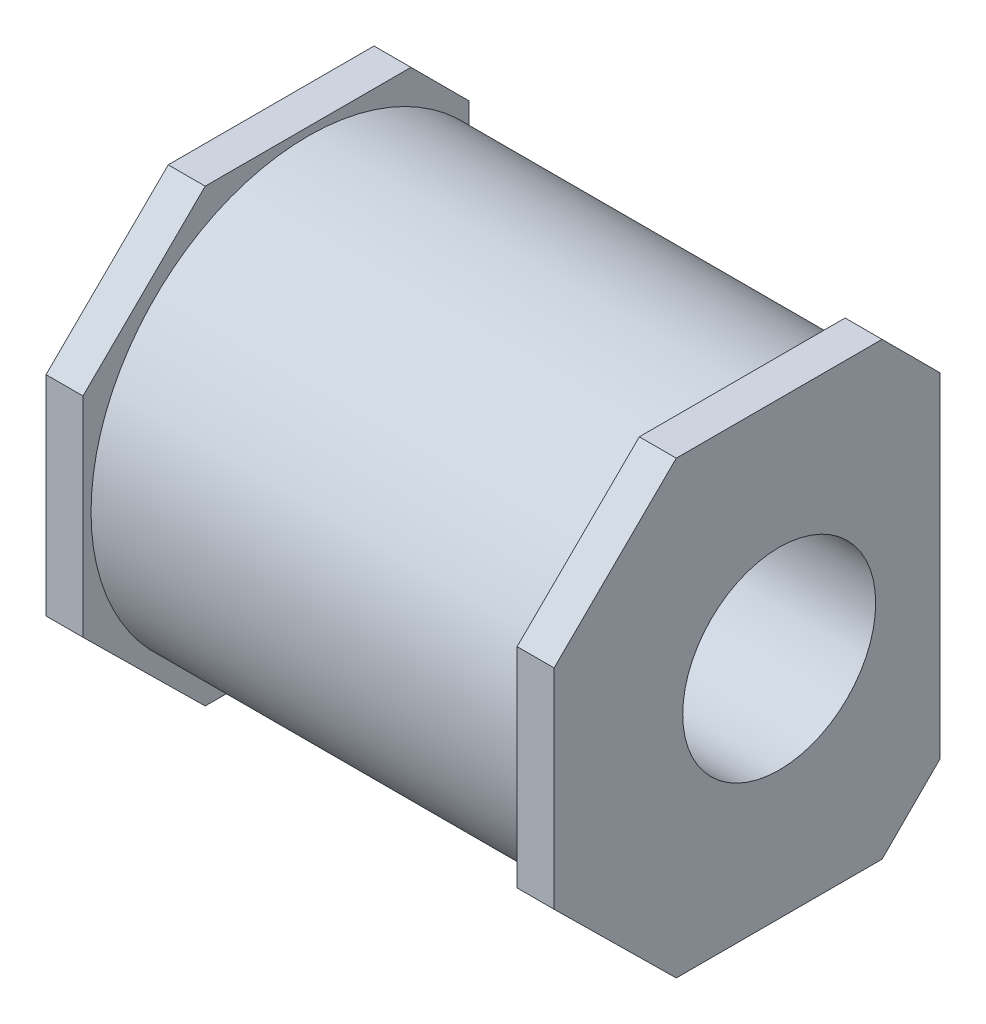
ISO-10303-21;
HEADER;
FILE_DESCRIPTION(('STEP AP214'),'2;1');
FILE_NAME('part.step','',(''),(''),'','','');
FILE_SCHEMA(('AUTOMOTIVE_DESIGN { 1 0 10303 214 1 1 1 1 }'));
ENDSEC;
DATA;
#1=APPLICATION_CONTEXT('core data for automotive mechanical design processes');
#2=APPLICATION_PROTOCOL_DEFINITION('international standard','automotive_design',2000,#1);
#3=PRODUCT_CONTEXT('',#1,'mechanical');
#4=PRODUCT('Part','Part','',(#3));
#5=PRODUCT_RELATED_PRODUCT_CATEGORY('part','',(#4));
#6=PRODUCT_DEFINITION_FORMATION('','',#4);
#7=PRODUCT_DEFINITION_CONTEXT('part definition',#1,'design');
#8=PRODUCT_DEFINITION('design','',#6,#7);
#9=PRODUCT_DEFINITION_SHAPE('','',#8);
#10=(LENGTH_UNIT() NAMED_UNIT(*) SI_UNIT(.MILLI.,.METRE.));
#11=(NAMED_UNIT(*) PLANE_ANGLE_UNIT() SI_UNIT($,.RADIAN.));
#12=(NAMED_UNIT(*) SI_UNIT($,.STERADIAN.) SOLID_ANGLE_UNIT());
#13=UNCERTAINTY_MEASURE_WITH_UNIT(LENGTH_MEASURE(1.E-05),#10,'distance_accuracy_value','');
#14=(GEOMETRIC_REPRESENTATION_CONTEXT(3) GLOBAL_UNCERTAINTY_ASSIGNED_CONTEXT((#13)) GLOBAL_UNIT_ASSIGNED_CONTEXT((#10,
#11,#12)) REPRESENTATION_CONTEXT('',''));
#15=CARTESIAN_POINT('',(0.,0.,0.));
#16=DIRECTION('',(0.,0.,1.));
#17=DIRECTION('',(1.,0.,0.));
#18=AXIS2_PLACEMENT_3D('',#15,#16,#17);
#19=CARTESIAN_POINT('',(-15.,2.4,19.1));
#20=DIRECTION('',(-1.,0.,0.));
#21=DIRECTION('',(0.,0.,1.));
#22=AXIS2_PLACEMENT_3D('',#19,#20,#21);
#23=CYLINDRICAL_SURFACE('',#22,6.);
#24=CARTESIAN_POINT('',(16.6,2.39999999999999,19.1));
#25=DIRECTION('',(-1.,0.,0.));
#26=DIRECTION('',(0.,0.,1.));
#27=AXIS2_PLACEMENT_3D('',#24,#25,#26);
#28=CIRCLE('',#27,6.);
#29=CARTESIAN_POINT('',(16.6,2.39999999999999,25.1));
#30=VERTEX_POINT('',#29);
#31=EDGE_CURVE('E239',#30,#30,#28,.F.);
#32=ORIENTED_EDGE('',*,*,#31,.T.);
#33=EDGE_LOOP('',(#32));
#34=FACE_BOUND('',#33,.T.);
#35=CARTESIAN_POINT('',(-15.,2.4,19.1));
#36=DIRECTION('',(-1.,0.,0.));
#37=DIRECTION('',(0.,0.,1.));
#38=AXIS2_PLACEMENT_3D('',#35,#36,#37);
#39=CIRCLE('',#38,6.);
#40=CARTESIAN_POINT('',(-15.,2.4,25.1));
#41=VERTEX_POINT('',#40);
#42=EDGE_CURVE('E20',#41,#41,#39,.F.);
#43=ORIENTED_EDGE('',*,*,#42,.F.);
#44=EDGE_LOOP('',(#43));
#45=FACE_BOUND('',#44,.T.);
#46=ADVANCED_FACE('F17',(#34,#45),#23,.F.);
#47=CARTESIAN_POINT('',(-15.,16.4,25.5));
#48=DIRECTION('',(0.,1.,0.));
#49=DIRECTION('',(0.,0.,1.));
#50=AXIS2_PLACEMENT_3D('',#47,#48,#49);
#51=PLANE('',#50);
#52=DIRECTION('',(0.,0.,1.));
#53=VECTOR('',#52,1.);
#54=CARTESIAN_POINT('',(16.6,16.4,20.291223236998));
#55=LINE('',#54,#53);
#56=CARTESIAN_POINT('',(16.6,16.3999999999993,25.4999999999993));
#57=VERTEX_POINT('',#56);
#58=CARTESIAN_POINT('',(16.6,16.4,12.7));
#59=VERTEX_POINT('',#58);
#60=EDGE_CURVE('E201',#57,#59,#55,.F.);
#61=ORIENTED_EDGE('',*,*,#60,.T.);
#62=DIRECTION('',(1.,0.,0.));
#63=VECTOR('',#62,1.);
#64=CARTESIAN_POINT('',(-15.,16.4,12.7));
#65=LINE('',#64,#63);
#66=CARTESIAN_POINT('',(14.3,16.4,12.7));
#67=VERTEX_POINT('',#66);
#68=EDGE_CURVE('E151',#67,#59,#65,.T.);
#69=ORIENTED_EDGE('',*,*,#68,.F.);
#70=DIRECTION('',(0.,0.,1.));
#71=VECTOR('',#70,1.);
#72=CARTESIAN_POINT('',(14.3,16.4,19.1));
#73=LINE('',#72,#71);
#74=CARTESIAN_POINT('',(14.3,16.3999999999993,25.4999999999993));
#75=VERTEX_POINT('',#74);
#76=EDGE_CURVE('E145',#67,#75,#73,.T.);
#77=ORIENTED_EDGE('',*,*,#76,.T.);
#78=DIRECTION('',(1.,0.,0.));
#79=VECTOR('',#78,1.);
#80=CARTESIAN_POINT('',(-15.,16.3999999999978,25.4999999999978));
#81=LINE('',#80,#79);
#82=EDGE_CURVE('E148',#57,#75,#81,.F.);
#83=ORIENTED_EDGE('',*,*,#82,.F.);
#84=EDGE_LOOP('',(#61,#69,#77,#83));
#85=FACE_BOUND('',#84,.T.);
#86=ADVANCED_FACE('F147',(#85),#51,.T.);
#87=CARTESIAN_POINT('',(-15.,8.9,33.1));
#88=DIRECTION('',(0.,0.711773999329005,0.702408551969005));
#89=DIRECTION('',(0.,-0.702408551969005,0.711773999329005));
#90=AXIS2_PLACEMENT_3D('',#87,#88,#89);
#91=PLANE('',#90);
#92=DIRECTION('',(0.,0.702408551969211,-0.711773999328801));
#93=VECTOR('',#92,1.);
#94=CARTESIAN_POINT('',(16.6,8.9,33.1));
#95=LINE('',#94,#93);
#96=CARTESIAN_POINT('',(16.6,8.9,33.1));
#97=VERTEX_POINT('',#96);
#98=EDGE_CURVE('E162',#97,#57,#95,.T.);
#99=ORIENTED_EDGE('',*,*,#98,.T.);
#100=ORIENTED_EDGE('',*,*,#82,.T.);
#101=DIRECTION('',(0.,-0.702408551969211,0.711773999328801));
#102=VECTOR('',#101,1.);
#103=CARTESIAN_POINT('',(14.3,16.4,25.5));
#104=LINE('',#103,#102);
#105=CARTESIAN_POINT('',(14.3,8.9,33.1));
#106=VERTEX_POINT('',#105);
#107=EDGE_CURVE('E155',#75,#106,#104,.T.);
#108=ORIENTED_EDGE('',*,*,#107,.T.);
#109=DIRECTION('',(1.,0.,0.));
#110=VECTOR('',#109,1.);
#111=CARTESIAN_POINT('',(-15.,8.9,33.1));
#112=LINE('',#111,#110);
#113=EDGE_CURVE('E164',#97,#106,#112,.F.);
#114=ORIENTED_EDGE('',*,*,#113,.F.);
#115=EDGE_LOOP('',(#99,#100,#108,#114));
#116=FACE_BOUND('',#115,.T.);
#117=ADVANCED_FACE('F159',(#116),#91,.T.);
#118=CARTESIAN_POINT('',(-15.,-4.1,33.1));
#119=DIRECTION('',(0.,0.,1.));
#120=DIRECTION('',(1.,0.,0.));
#121=AXIS2_PLACEMENT_3D('',#118,#119,#120);
#122=PLANE('',#121);
#123=DIRECTION('',(0.,-1.,0.));
#124=VECTOR('',#123,1.);
#125=CARTESIAN_POINT('',(16.6,2.4,33.1));
#126=LINE('',#125,#124);
#127=CARTESIAN_POINT('',(16.6,-4.10000000000074,33.1000000000007));
#128=VERTEX_POINT('',#127);
#129=EDGE_CURVE('E207',#128,#97,#126,.F.);
#130=ORIENTED_EDGE('',*,*,#129,.T.);
#131=ORIENTED_EDGE('',*,*,#113,.T.);
#132=DIRECTION('',(0.,1.,0.));
#133=VECTOR('',#132,1.);
#134=CARTESIAN_POINT('',(14.3,2.4,33.1));
#135=LINE('',#134,#133);
#136=CARTESIAN_POINT('',(14.3,-4.10000000000074,33.1000000000007));
#137=VERTEX_POINT('',#136);
#138=EDGE_CURVE('E170',#106,#137,#135,.F.);
#139=ORIENTED_EDGE('',*,*,#138,.T.);
#140=DIRECTION('',(1.,0.,0.));
#141=VECTOR('',#140,1.);
#142=CARTESIAN_POINT('',(-15.,-4.10000000000221,33.1000000000022));
#143=LINE('',#142,#141);
#144=EDGE_CURVE('E364',#128,#137,#143,.F.);
#145=ORIENTED_EDGE('',*,*,#144,.F.);
#146=EDGE_LOOP('',(#130,#131,#139,#145));
#147=FACE_BOUND('',#146,.T.);
#148=ADVANCED_FACE('F376',(#147),#122,.T.);
#149=CARTESIAN_POINT('',(-15.,-11.6,25.5));
#150=DIRECTION('',(0.,-0.711773999329005,0.702408551969005));
#151=DIRECTION('',(0.,-0.702408551969005,-0.711773999329005));
#152=AXIS2_PLACEMENT_3D('',#149,#150,#151);
#153=PLANE('',#152);
#154=DIRECTION('',(0.,0.702408551969211,0.711773999328801));
#155=VECTOR('',#154,1.);
#156=CARTESIAN_POINT('',(16.6,-11.6,25.5));
#157=LINE('',#156,#155);
#158=CARTESIAN_POINT('',(16.6,-11.6,25.5));
#159=VERTEX_POINT('',#158);
#160=EDGE_CURVE('E198',#159,#128,#157,.T.);
#161=ORIENTED_EDGE('',*,*,#160,.T.);
#162=ORIENTED_EDGE('',*,*,#144,.T.);
#163=DIRECTION('',(0.,-0.702408551969211,-0.711773999328801));
#164=VECTOR('',#163,1.);
#165=CARTESIAN_POINT('',(14.3,-4.1,33.1));
#166=LINE('',#165,#164);
#167=CARTESIAN_POINT('',(14.3,-11.6,25.5));
#168=VERTEX_POINT('',#167);
#169=EDGE_CURVE('E172',#137,#168,#166,.T.);
#170=ORIENTED_EDGE('',*,*,#169,.T.);
#171=DIRECTION('',(1.,0.,0.));
#172=VECTOR('',#171,1.);
#173=CARTESIAN_POINT('',(-15.,-11.6,25.5));
#174=LINE('',#173,#172);
#175=EDGE_CURVE('E344',#159,#168,#174,.F.);
#176=ORIENTED_EDGE('',*,*,#175,.F.);
#177=EDGE_LOOP('',(#161,#162,#170,#176));
#178=FACE_BOUND('',#177,.T.);
#179=ADVANCED_FACE('F422',(#178),#153,.T.);
#180=CARTESIAN_POINT('',(-15.,-11.6,12.7));
#181=DIRECTION('',(0.,-1.,0.));
#182=DIRECTION('',(0.,0.,-1.));
#183=AXIS2_PLACEMENT_3D('',#180,#181,#182);
#184=PLANE('',#183);
#185=DIRECTION('',(0.,0.,1.));
#186=VECTOR('',#185,1.);
#187=CARTESIAN_POINT('',(16.6,-11.6,20.291223236998));
#188=LINE('',#187,#186);
#189=CARTESIAN_POINT('',(16.6,-11.6,12.7));
#190=VERTEX_POINT('',#189);
#191=EDGE_CURVE('E185',#190,#159,#188,.T.);
#192=ORIENTED_EDGE('',*,*,#191,.T.);
#193=ORIENTED_EDGE('',*,*,#175,.T.);
#194=DIRECTION('',(0.,0.,1.));
#195=VECTOR('',#194,1.);
#196=CARTESIAN_POINT('',(14.3,-11.6,19.1));
#197=LINE('',#196,#195);
#198=CARTESIAN_POINT('',(14.3,-11.6,12.7));
#199=VERTEX_POINT('',#198);
#200=EDGE_CURVE('E358',#168,#199,#197,.F.);
#201=ORIENTED_EDGE('',*,*,#200,.T.);
#202=DIRECTION('',(1.,0.,0.));
#203=VECTOR('',#202,1.);
#204=CARTESIAN_POINT('',(-15.,-11.6,12.7));
#205=LINE('',#204,#203);
#206=EDGE_CURVE('E245',#190,#199,#205,.F.);
#207=ORIENTED_EDGE('',*,*,#206,.F.);
#208=EDGE_LOOP('',(#192,#193,#201,#207));
#209=FACE_BOUND('',#208,.T.);
#210=ADVANCED_FACE('F420',(#209),#184,.T.);
#211=CARTESIAN_POINT('',(-15.,16.4,25.5));
#212=DIRECTION('',(0.,1.,0.));
#213=DIRECTION('',(0.,0.,1.));
#214=AXIS2_PLACEMENT_3D('',#211,#212,#213);
#215=PLANE('',#214);
#216=DIRECTION('',(0.,0.,1.));
#217=VECTOR('',#216,1.);
#218=CARTESIAN_POINT('',(-12.7,16.4,19.1));
#219=LINE('',#218,#217);
#220=CARTESIAN_POINT('',(-12.7,16.4,12.7));
#221=VERTEX_POINT('',#220);
#222=CARTESIAN_POINT('',(-12.7,16.3999999999993,25.4999999999993));
#223=VERTEX_POINT('',#222);
#224=EDGE_CURVE('E283',#221,#223,#219,.T.);
#225=ORIENTED_EDGE('',*,*,#224,.F.);
#226=DIRECTION('',(1.,0.,0.));
#227=VECTOR('',#226,1.);
#228=CARTESIAN_POINT('',(-15.,16.4,12.7));
#229=LINE('',#228,#227);
#230=CARTESIAN_POINT('',(-15.,16.4,12.7));
#231=VERTEX_POINT('',#230);
#232=EDGE_CURVE('E186',#231,#221,#229,.T.);
#233=ORIENTED_EDGE('',*,*,#232,.F.);
#234=DIRECTION('',(0.,0.,1.));
#235=VECTOR('',#234,1.);
#236=CARTESIAN_POINT('',(-15.,16.4,20.291223236998));
#237=LINE('',#236,#235);
#238=CARTESIAN_POINT('',(-15.,16.3999999999993,25.4999999999993));
#239=VERTEX_POINT('',#238);
#240=EDGE_CURVE('E218',#239,#231,#237,.F.);
#241=ORIENTED_EDGE('',*,*,#240,.F.);
#242=DIRECTION('',(1.,0.,0.));
#243=VECTOR('',#242,1.);
#244=CARTESIAN_POINT('',(-15.,16.3999999999978,25.4999999999978));
#245=LINE('',#244,#243);
#246=EDGE_CURVE('E336',#223,#239,#245,.F.);
#247=ORIENTED_EDGE('',*,*,#246,.F.);
#248=EDGE_LOOP('',(#225,#233,#241,#247));
#249=FACE_BOUND('',#248,.T.);
#250=ADVANCED_FACE('F430',(#249),#215,.T.);
#251=CARTESIAN_POINT('',(-15.,8.9,33.1));
#252=DIRECTION('',(0.,0.711773999329005,0.702408551969005));
#253=DIRECTION('',(0.,-0.702408551969005,0.711773999329005));
#254=AXIS2_PLACEMENT_3D('',#251,#252,#253);
#255=PLANE('',#254);
#256=DIRECTION('',(0.,-0.702408551969211,0.711773999328801));
#257=VECTOR('',#256,1.);
#258=CARTESIAN_POINT('',(-12.7,16.4,25.5));
#259=LINE('',#258,#257);
#260=CARTESIAN_POINT('',(-12.7,8.9,33.1));
#261=VERTEX_POINT('',#260);
#262=EDGE_CURVE('E332',#223,#261,#259,.T.);
#263=ORIENTED_EDGE('',*,*,#262,.F.);
#264=ORIENTED_EDGE('',*,*,#246,.T.);
#265=DIRECTION('',(0.,0.702408551969211,-0.711773999328801));
#266=VECTOR('',#265,1.);
#267=CARTESIAN_POINT('',(-15.,8.9,33.1));
#268=LINE('',#267,#266);
#269=CARTESIAN_POINT('',(-15.,8.9,33.1));
#270=VERTEX_POINT('',#269);
#271=EDGE_CURVE('E220',#270,#239,#268,.T.);
#272=ORIENTED_EDGE('',*,*,#271,.F.);
#273=DIRECTION('',(1.,0.,0.));
#274=VECTOR('',#273,1.);
#275=CARTESIAN_POINT('',(-15.,8.9,33.1));
#276=LINE('',#275,#274);
#277=EDGE_CURVE('E327',#261,#270,#276,.F.);
#278=ORIENTED_EDGE('',*,*,#277,.F.);
#279=EDGE_LOOP('',(#263,#264,#272,#278));
#280=FACE_BOUND('',#279,.T.);
#281=ADVANCED_FACE('F474',(#280),#255,.T.);
#282=CARTESIAN_POINT('',(-15.,-4.1,33.1));
#283=DIRECTION('',(0.,0.,1.));
#284=DIRECTION('',(1.,0.,0.));
#285=AXIS2_PLACEMENT_3D('',#282,#283,#284);
#286=PLANE('',#285);
#287=DIRECTION('',(0.,1.,0.));
#288=VECTOR('',#287,1.);
#289=CARTESIAN_POINT('',(-12.7,2.4,33.1));
#290=LINE('',#289,#288);
#291=CARTESIAN_POINT('',(-12.7,-4.10000000000074,33.1000000000007));
#292=VERTEX_POINT('',#291);
#293=EDGE_CURVE('E323',#261,#292,#290,.F.);
#294=ORIENTED_EDGE('',*,*,#293,.F.);
#295=ORIENTED_EDGE('',*,*,#277,.T.);
#296=DIRECTION('',(0.,-1.,0.));
#297=VECTOR('',#296,1.);
#298=CARTESIAN_POINT('',(-15.,2.4,33.1));
#299=LINE('',#298,#297);
#300=CARTESIAN_POINT('',(-15.,-4.10000000000073,33.1000000000007));
#301=VERTEX_POINT('',#300);
#302=EDGE_CURVE('E225',#301,#270,#299,.F.);
#303=ORIENTED_EDGE('',*,*,#302,.F.);
#304=DIRECTION('',(1.,0.,0.));
#305=VECTOR('',#304,1.);
#306=CARTESIAN_POINT('',(-15.,-4.1000000000022,33.1000000000022));
#307=LINE('',#306,#305);
#308=EDGE_CURVE('E318',#292,#301,#307,.F.);
#309=ORIENTED_EDGE('',*,*,#308,.F.);
#310=EDGE_LOOP('',(#294,#295,#303,#309));
#311=FACE_BOUND('',#310,.T.);
#312=ADVANCED_FACE('F470',(#311),#286,.T.);
#313=CARTESIAN_POINT('',(-15.,-11.6,25.5));
#314=DIRECTION('',(0.,-0.711773999329005,0.702408551969005));
#315=DIRECTION('',(0.,-0.702408551969005,-0.711773999329005));
#316=AXIS2_PLACEMENT_3D('',#313,#314,#315);
#317=PLANE('',#316);
#318=DIRECTION('',(0.,-0.702408551969211,-0.711773999328801));
#319=VECTOR('',#318,1.);
#320=CARTESIAN_POINT('',(-12.7,-4.1,33.1));
#321=LINE('',#320,#319);
#322=CARTESIAN_POINT('',(-12.7,-11.6,25.5));
#323=VERTEX_POINT('',#322);
#324=EDGE_CURVE('E314',#292,#323,#321,.T.);
#325=ORIENTED_EDGE('',*,*,#324,.F.);
#326=ORIENTED_EDGE('',*,*,#308,.T.);
#327=DIRECTION('',(0.,0.702408551969211,0.711773999328801));
#328=VECTOR('',#327,1.);
#329=CARTESIAN_POINT('',(-15.,-11.6,25.5));
#330=LINE('',#329,#328);
#331=CARTESIAN_POINT('',(-15.,-11.6,25.5));
#332=VERTEX_POINT('',#331);
#333=EDGE_CURVE('E192',#332,#301,#330,.T.);
#334=ORIENTED_EDGE('',*,*,#333,.F.);
#335=DIRECTION('',(1.,0.,0.));
#336=VECTOR('',#335,1.);
#337=CARTESIAN_POINT('',(-15.,-11.6,25.5));
#338=LINE('',#337,#336);
#339=EDGE_CURVE('E193',#323,#332,#338,.F.);
#340=ORIENTED_EDGE('',*,*,#339,.F.);
#341=EDGE_LOOP('',(#325,#326,#334,#340));
#342=FACE_BOUND('',#341,.T.);
#343=ADVANCED_FACE('F466',(#342),#317,.T.);
#344=CARTESIAN_POINT('',(-15.,-11.6,12.7));
#345=DIRECTION('',(0.,-1.,0.));
#346=DIRECTION('',(0.,0.,-1.));
#347=AXIS2_PLACEMENT_3D('',#344,#345,#346);
#348=PLANE('',#347);
#349=DIRECTION('',(0.,0.,1.));
#350=VECTOR('',#349,1.);
#351=CARTESIAN_POINT('',(-12.7,-11.6,19.1));
#352=LINE('',#351,#350);
#353=CARTESIAN_POINT('',(-12.7,-11.6,12.7));
#354=VERTEX_POINT('',#353);
#355=EDGE_CURVE('E311',#323,#354,#352,.F.);
#356=ORIENTED_EDGE('',*,*,#355,.F.);
#357=ORIENTED_EDGE('',*,*,#339,.T.);
#358=DIRECTION('',(0.,0.,1.));
#359=VECTOR('',#358,1.);
#360=CARTESIAN_POINT('',(-15.,-11.6,20.291223236998));
#361=LINE('',#360,#359);
#362=CARTESIAN_POINT('',(-15.,-11.6,12.7));
#363=VERTEX_POINT('',#362);
#364=EDGE_CURVE('E189',#363,#332,#361,.T.);
#365=ORIENTED_EDGE('',*,*,#364,.F.);
#366=DIRECTION('',(1.,0.,0.));
#367=VECTOR('',#366,1.);
#368=CARTESIAN_POINT('',(-15.,-11.6,12.7));
#369=LINE('',#368,#367);
#370=EDGE_CURVE('E274',#354,#363,#369,.F.);
#371=ORIENTED_EDGE('',*,*,#370,.F.);
#372=EDGE_LOOP('',(#356,#357,#365,#371));
#373=FACE_BOUND('',#372,.T.);
#374=ADVANCED_FACE('F462',(#373),#348,.T.);
#375=CARTESIAN_POINT('',(-15.,2.4,20.291223236998));
#376=DIRECTION('',(-1.,0.,0.));
#377=DIRECTION('',(0.,-1.,0.));
#378=AXIS2_PLACEMENT_3D('',#375,#376,#377);
#379=PLANE('',#378);
#380=ORIENTED_EDGE('',*,*,#42,.T.);
#381=EDGE_LOOP('',(#380));
#382=FACE_BOUND('',#381,.T.);
#383=DIRECTION('',(0.,0.707106781186548,0.707106781186548));
#384=VECTOR('',#383,1.);
#385=CARTESIAN_POINT('',(-15.,16.4,12.7));
#386=LINE('',#385,#384);
#387=CARTESIAN_POINT('',(-15.,12.8,9.1));
#388=VERTEX_POINT('',#387);
#389=EDGE_CURVE('E292',#388,#231,#386,.T.);
#390=ORIENTED_EDGE('',*,*,#389,.F.);
#391=DIRECTION('',(0.,1.,0.));
#392=VECTOR('',#391,1.);
#393=CARTESIAN_POINT('',(-15.,12.8,9.1));
#394=LINE('',#393,#392);
#395=CARTESIAN_POINT('',(-15.,-8.,9.1));
#396=VERTEX_POINT('',#395);
#397=EDGE_CURVE('E289',#396,#388,#394,.T.);
#398=ORIENTED_EDGE('',*,*,#397,.F.);
#399=DIRECTION('',(0.,0.707106781186548,-0.707106781186548));
#400=VECTOR('',#399,1.);
#401=CARTESIAN_POINT('',(-15.,-8.,9.1));
#402=LINE('',#401,#400);
#403=EDGE_CURVE('E302',#363,#396,#402,.T.);
#404=ORIENTED_EDGE('',*,*,#403,.F.);
#405=ORIENTED_EDGE('',*,*,#364,.T.);
#406=ORIENTED_EDGE('',*,*,#333,.T.);
#407=ORIENTED_EDGE('',*,*,#302,.T.);
#408=ORIENTED_EDGE('',*,*,#271,.T.);
#409=ORIENTED_EDGE('',*,*,#240,.T.);
#410=EDGE_LOOP('',(#390,#398,#404,#405,#406,#407,#408,#409));
#411=FACE_BOUND('',#410,.T.);
#412=ADVANCED_FACE('F459',(#382,#411),#379,.T.);
#413=CARTESIAN_POINT('',(-15.,16.4,12.7));
#414=DIRECTION('',(0.,0.707106781186548,-0.707106781186548));
#415=DIRECTION('',(0.,0.707106781186548,0.707106781186548));
#416=AXIS2_PLACEMENT_3D('',#413,#414,#415);
#417=PLANE('',#416);
#418=DIRECTION('',(0.,0.707106781186547,0.707106781186548));
#419=VECTOR('',#418,1.);
#420=CARTESIAN_POINT('',(-12.7,12.8,9.1));
#421=LINE('',#420,#419);
#422=CARTESIAN_POINT('',(-12.7,12.8,9.1));
#423=VERTEX_POINT('',#422);
#424=EDGE_CURVE('E57',#423,#221,#421,.T.);
#425=ORIENTED_EDGE('',*,*,#424,.F.);
#426=DIRECTION('',(-1.,0.,0.));
#427=VECTOR('',#426,1.);
#428=CARTESIAN_POINT('',(-15.,12.8,9.1));
#429=LINE('',#428,#427);
#430=EDGE_CURVE('E279',#388,#423,#429,.F.);
#431=ORIENTED_EDGE('',*,*,#430,.F.);
#432=ORIENTED_EDGE('',*,*,#389,.T.);
#433=ORIENTED_EDGE('',*,*,#232,.T.);
#434=EDGE_LOOP('',(#425,#431,#432,#433));
#435=FACE_BOUND('',#434,.T.);
#436=ADVANCED_FACE('F456',(#435),#417,.T.);
#437=CARTESIAN_POINT('',(-15.,16.4,12.7));
#438=DIRECTION('',(0.,0.707106781186548,-0.707106781186548));
#439=DIRECTION('',(0.,0.707106781186548,0.707106781186548));
#440=AXIS2_PLACEMENT_3D('',#437,#438,#439);
#441=PLANE('',#440);
#442=DIRECTION('',(0.,-0.707106781186547,-0.707106781186548));
#443=VECTOR('',#442,1.);
#444=CARTESIAN_POINT('',(16.6,16.4,12.7));
#445=LINE('',#444,#443);
#446=CARTESIAN_POINT('',(16.6,12.8,9.10000000000002));
#447=VERTEX_POINT('',#446);
#448=EDGE_CURVE('E203',#59,#447,#445,.T.);
#449=ORIENTED_EDGE('',*,*,#448,.T.);
#450=DIRECTION('',(-1.,0.,0.));
#451=VECTOR('',#450,1.);
#452=CARTESIAN_POINT('',(-15.,12.8,9.1));
#453=LINE('',#452,#451);
#454=CARTESIAN_POINT('',(14.3,12.8,9.10000000000001));
#455=VERTEX_POINT('',#454);
#456=EDGE_CURVE('E258',#455,#447,#453,.F.);
#457=ORIENTED_EDGE('',*,*,#456,.F.);
#458=DIRECTION('',(0.,0.707106781186547,0.707106781186548));
#459=VECTOR('',#458,1.);
#460=CARTESIAN_POINT('',(14.3,12.8,9.1));
#461=LINE('',#460,#459);
#462=EDGE_CURVE('E156',#455,#67,#461,.T.);
#463=ORIENTED_EDGE('',*,*,#462,.T.);
#464=ORIENTED_EDGE('',*,*,#68,.T.);
#465=EDGE_LOOP('',(#449,#457,#463,#464));
#466=FACE_BOUND('',#465,.T.);
#467=ADVANCED_FACE('F381',(#466),#441,.T.);
#468=CARTESIAN_POINT('',(16.6,2.4,20.291223236998));
#469=DIRECTION('',(-1.,0.,0.));
#470=DIRECTION('',(0.,-1.,0.));
#471=AXIS2_PLACEMENT_3D('',#468,#469,#470);
#472=PLANE('',#471);
#473=ORIENTED_EDGE('',*,*,#31,.F.);
#474=EDGE_LOOP('',(#473));
#475=FACE_BOUND('',#474,.T.);
#476=ORIENTED_EDGE('',*,*,#448,.F.);
#477=ORIENTED_EDGE('',*,*,#60,.F.);
#478=ORIENTED_EDGE('',*,*,#98,.F.);
#479=ORIENTED_EDGE('',*,*,#129,.F.);
#480=ORIENTED_EDGE('',*,*,#160,.F.);
#481=ORIENTED_EDGE('',*,*,#191,.F.);
#482=DIRECTION('',(0.,0.707106781186548,-0.707106781186548));
#483=VECTOR('',#482,1.);
#484=CARTESIAN_POINT('',(16.6,-7.99999999999999,9.10000000000001));
#485=LINE('',#484,#483);
#486=CARTESIAN_POINT('',(16.6,-8.,9.10000000000003));
#487=VERTEX_POINT('',#486);
#488=EDGE_CURVE('E241',#487,#190,#485,.F.);
#489=ORIENTED_EDGE('',*,*,#488,.F.);
#490=DIRECTION('',(0.,1.,0.));
#491=VECTOR('',#490,1.);
#492=CARTESIAN_POINT('',(16.6,12.8,9.10000000000002));
#493=LINE('',#492,#491);
#494=EDGE_CURVE('E261',#447,#487,#493,.F.);
#495=ORIENTED_EDGE('',*,*,#494,.F.);
#496=EDGE_LOOP('',(#476,#477,#478,#479,#480,#481,#489,#495));
#497=FACE_BOUND('',#496,.T.);
#498=ADVANCED_FACE('F380',(#475,#497),#472,.F.);
#499=CARTESIAN_POINT('',(-15.,-8.,9.1));
#500=DIRECTION('',(0.,-0.707106781186548,-0.707106781186548));
#501=DIRECTION('',(0.,0.707106781186548,-0.707106781186548));
#502=AXIS2_PLACEMENT_3D('',#499,#500,#501);
#503=PLANE('',#502);
#504=ORIENTED_EDGE('',*,*,#488,.T.);
#505=ORIENTED_EDGE('',*,*,#206,.T.);
#506=DIRECTION('',(0.,0.707106781186548,-0.707106781186548));
#507=VECTOR('',#506,1.);
#508=CARTESIAN_POINT('',(14.3,-11.6,12.7));
#509=LINE('',#508,#507);
#510=CARTESIAN_POINT('',(14.3,-8.,9.10000000000002));
#511=VERTEX_POINT('',#510);
#512=EDGE_CURVE('E284',#199,#511,#509,.T.);
#513=ORIENTED_EDGE('',*,*,#512,.T.);
#514=DIRECTION('',(-1.,0.,0.));
#515=VECTOR('',#514,1.);
#516=CARTESIAN_POINT('',(-15.,-8.,9.10000000000001));
#517=LINE('',#516,#515);
#518=EDGE_CURVE('E394',#487,#511,#517,.T.);
#519=ORIENTED_EDGE('',*,*,#518,.F.);
#520=EDGE_LOOP('',(#504,#505,#513,#519));
#521=FACE_BOUND('',#520,.T.);
#522=ADVANCED_FACE('F417',(#521),#503,.T.);
#523=CARTESIAN_POINT('',(-15.,-8.,9.1));
#524=DIRECTION('',(0.,-0.707106781186548,-0.707106781186548));
#525=DIRECTION('',(0.,0.707106781186548,-0.707106781186548));
#526=AXIS2_PLACEMENT_3D('',#523,#524,#525);
#527=PLANE('',#526);
#528=DIRECTION('',(0.,0.707106781186548,-0.707106781186548));
#529=VECTOR('',#528,1.);
#530=CARTESIAN_POINT('',(-12.7,-11.6,12.7));
#531=LINE('',#530,#529);
#532=CARTESIAN_POINT('',(-12.7,-8.,9.10000000000001));
#533=VERTEX_POINT('',#532);
#534=EDGE_CURVE('E299',#354,#533,#531,.T.);
#535=ORIENTED_EDGE('',*,*,#534,.F.);
#536=ORIENTED_EDGE('',*,*,#370,.T.);
#537=ORIENTED_EDGE('',*,*,#403,.T.);
#538=DIRECTION('',(-1.,0.,0.));
#539=VECTOR('',#538,1.);
#540=CARTESIAN_POINT('',(-15.,-8.,9.10000000000001));
#541=LINE('',#540,#539);
#542=EDGE_CURVE('E238',#533,#396,#541,.T.);
#543=ORIENTED_EDGE('',*,*,#542,.F.);
#544=EDGE_LOOP('',(#535,#536,#537,#543));
#545=FACE_BOUND('',#544,.T.);
#546=ADVANCED_FACE('F445',(#545),#527,.T.);
#547=CARTESIAN_POINT('',(14.3,2.4,19.1));
#548=DIRECTION('',(1.,0.,0.));
#549=DIRECTION('',(0.,1.,0.));
#550=AXIS2_PLACEMENT_3D('',#547,#548,#549);
#551=PLANE('',#550);
#552=ORIENTED_EDGE('',*,*,#512,.F.);
#553=ORIENTED_EDGE('',*,*,#200,.F.);
#554=ORIENTED_EDGE('',*,*,#169,.F.);
#555=ORIENTED_EDGE('',*,*,#138,.F.);
#556=ORIENTED_EDGE('',*,*,#107,.F.);
#557=ORIENTED_EDGE('',*,*,#76,.F.);
#558=ORIENTED_EDGE('',*,*,#462,.F.);
#559=DIRECTION('',(0.,1.,0.));
#560=VECTOR('',#559,1.);
#561=CARTESIAN_POINT('',(14.3,12.8,9.10000000000002));
#562=LINE('',#561,#560);
#563=CARTESIAN_POINT('',(14.3,11.4691785736088,9.10000000000002));
#564=VERTEX_POINT('',#563);
#565=EDGE_CURVE('E262',#564,#455,#562,.T.);
#566=ORIENTED_EDGE('',*,*,#565,.F.);
#567=CARTESIAN_POINT('',(14.3,2.4,19.1));
#568=DIRECTION('',(1.,0.,0.));
#569=DIRECTION('',(0.,0.,-1.));
#570=AXIS2_PLACEMENT_3D('',#567,#568,#569);
#571=CIRCLE('',#570,13.5);
#572=CARTESIAN_POINT('',(14.3,-6.66917857360868,9.10000000000014));
#573=VERTEX_POINT('',#572);
#574=EDGE_CURVE('E237',#573,#564,#571,.F.);
#575=ORIENTED_EDGE('',*,*,#574,.F.);
#576=DIRECTION('',(0.,1.,0.));
#577=VECTOR('',#576,1.);
#578=CARTESIAN_POINT('',(14.3,12.8,9.10000000000002));
#579=LINE('',#578,#577);
#580=EDGE_CURVE('E391',#511,#573,#579,.T.);
#581=ORIENTED_EDGE('',*,*,#580,.F.);
#582=EDGE_LOOP('',(#552,#553,#554,#555,#556,#557,#558,#566,#575,#581));
#583=FACE_BOUND('',#582,.T.);
#584=ADVANCED_FACE('F168',(#583),#551,.F.);
#585=CARTESIAN_POINT('',(-12.7,2.4,19.1));
#586=DIRECTION('',(1.,0.,0.));
#587=DIRECTION('',(0.,1.,0.));
#588=AXIS2_PLACEMENT_3D('',#585,#586,#587);
#589=PLANE('',#588);
#590=ORIENTED_EDGE('',*,*,#534,.T.);
#591=DIRECTION('',(0.,1.,0.));
#592=VECTOR('',#591,1.);
#593=CARTESIAN_POINT('',(-12.7,12.8,9.1));
#594=LINE('',#593,#592);
#595=CARTESIAN_POINT('',(-12.7,-6.66917857360867,9.10000000000012));
#596=VERTEX_POINT('',#595);
#597=EDGE_CURVE('E35',#596,#533,#594,.F.);
#598=ORIENTED_EDGE('',*,*,#597,.F.);
#599=CARTESIAN_POINT('',(-12.7,2.40000000000001,19.1));
#600=DIRECTION('',(1.,0.,0.));
#601=DIRECTION('',(0.,0.,-1.));
#602=AXIS2_PLACEMENT_3D('',#599,#600,#601);
#603=CIRCLE('',#602,13.5);
#604=CARTESIAN_POINT('',(-12.7,11.4691785736088,9.1));
#605=VERTEX_POINT('',#604);
#606=EDGE_CURVE('E26',#605,#596,#603,.T.);
#607=ORIENTED_EDGE('',*,*,#606,.F.);
#608=DIRECTION('',(0.,1.,0.));
#609=VECTOR('',#608,1.);
#610=CARTESIAN_POINT('',(-12.7,12.8,9.1));
#611=LINE('',#610,#609);
#612=EDGE_CURVE('E272',#423,#605,#611,.F.);
#613=ORIENTED_EDGE('',*,*,#612,.F.);
#614=ORIENTED_EDGE('',*,*,#424,.T.);
#615=ORIENTED_EDGE('',*,*,#224,.T.);
#616=ORIENTED_EDGE('',*,*,#262,.T.);
#617=ORIENTED_EDGE('',*,*,#293,.T.);
#618=ORIENTED_EDGE('',*,*,#324,.T.);
#619=ORIENTED_EDGE('',*,*,#355,.T.);
#620=EDGE_LOOP('',(#590,#598,#607,#613,#614,#615,#616,#617,#618,#619));
#621=FACE_BOUND('',#620,.T.);
#622=ADVANCED_FACE('F438',(#621),#589,.T.);
#623=CARTESIAN_POINT('',(-15.,12.8,9.1));
#624=DIRECTION('',(0.,0.,-1.));
#625=DIRECTION('',(-1.,0.,0.));
#626=AXIS2_PLACEMENT_3D('',#623,#624,#625);
#627=PLANE('',#626);
#628=ORIENTED_EDGE('',*,*,#597,.T.);
#629=ORIENTED_EDGE('',*,*,#542,.T.);
#630=ORIENTED_EDGE('',*,*,#397,.T.);
#631=ORIENTED_EDGE('',*,*,#430,.T.);
#632=ORIENTED_EDGE('',*,*,#612,.T.);
#633=DIRECTION('',(-1.,0.,0.));
#634=VECTOR('',#633,1.);
#635=CARTESIAN_POINT('',(-15.,11.469178573609,9.1));
#636=LINE('',#635,#634);
#637=EDGE_CURVE('E267',#605,#564,#636,.F.);
#638=ORIENTED_EDGE('',*,*,#637,.T.);
#639=ORIENTED_EDGE('',*,*,#565,.T.);
#640=ORIENTED_EDGE('',*,*,#456,.T.);
#641=ORIENTED_EDGE('',*,*,#494,.T.);
#642=ORIENTED_EDGE('',*,*,#518,.T.);
#643=ORIENTED_EDGE('',*,*,#580,.T.);
#644=DIRECTION('',(1.,0.,0.));
#645=VECTOR('',#644,1.);
#646=CARTESIAN_POINT('',(14.3,-6.6691785736088,9.10000000000025));
#647=LINE('',#646,#645);
#648=EDGE_CURVE('E11',#596,#573,#647,.T.);
#649=ORIENTED_EDGE('',*,*,#648,.F.);
#650=EDGE_LOOP('',(#628,#629,#630,#631,#632,#638,#639,#640,#641,#642,#643,#649));
#651=FACE_BOUND('',#650,.T.);
#652=ADVANCED_FACE('F386',(#651),#627,.T.);
#653=CARTESIAN_POINT('',(14.3,2.4,19.1));
#654=DIRECTION('',(1.,0.,0.));
#655=DIRECTION('',(0.,0.,-1.));
#656=AXIS2_PLACEMENT_3D('',#653,#654,#655);
#657=CYLINDRICAL_SURFACE('',#656,13.5);
#658=ORIENTED_EDGE('',*,*,#606,.T.);
#659=ORIENTED_EDGE('',*,*,#648,.T.);
#660=ORIENTED_EDGE('',*,*,#574,.T.);
#661=ORIENTED_EDGE('',*,*,#637,.F.);
#662=EDGE_LOOP('',(#658,#659,#660,#661));
#663=FACE_BOUND('',#662,.T.);
#664=ADVANCED_FACE('F388',(#663),#657,.T.);
#665=CLOSED_SHELL('',(#46,#86,#117,#148,#179,#210,#250,#281,#312,#343,#374,#412,#436,#467,#498,
#522,#546,#584,#622,#652,#664));
#666=MANIFOLD_SOLID_BREP('B1',#665);
#667=ADVANCED_BREP_SHAPE_REPRESENTATION('',(#18,#666),#14);
#668=SHAPE_DEFINITION_REPRESENTATION(#9,#667);
ENDSEC;
END-ISO-10303-21;
